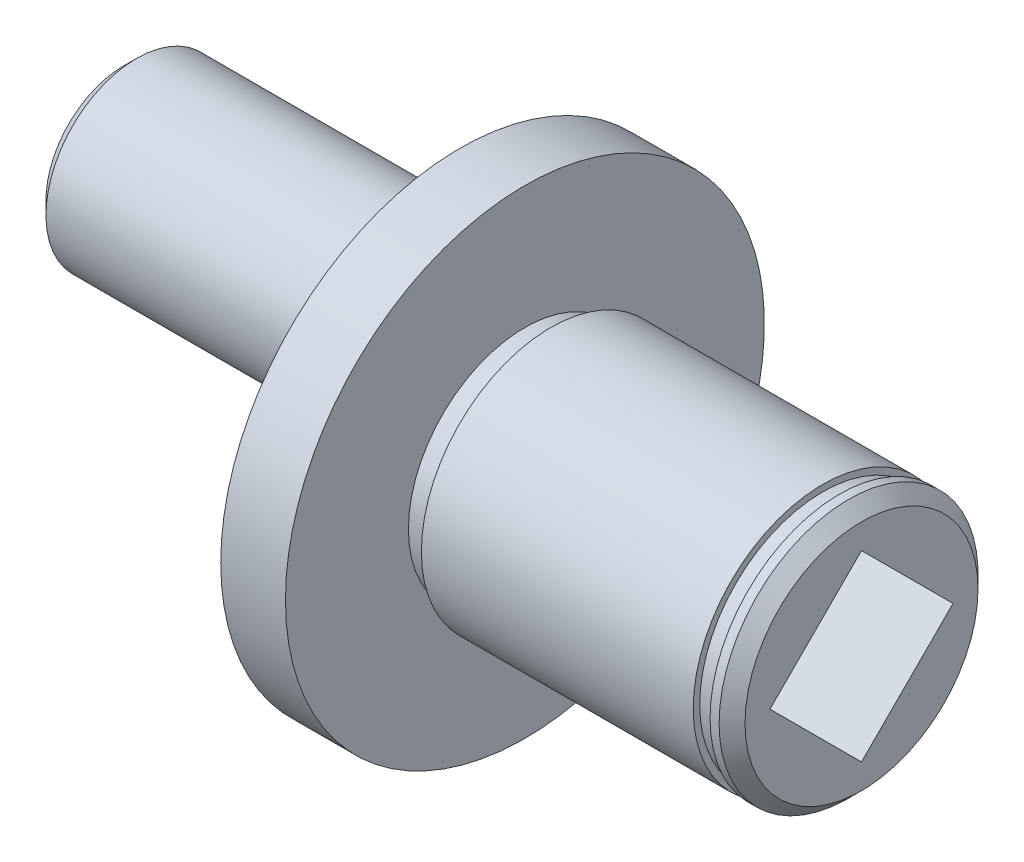
ISO-10303-21;
HEADER;
FILE_DESCRIPTION(('STEP AP214'),'2;1');
FILE_NAME('part.step','',(''),(''),'','','');
FILE_SCHEMA(('AUTOMOTIVE_DESIGN { 1 0 10303 214 1 1 1 1 }'));
ENDSEC;
DATA;
#1=APPLICATION_CONTEXT('core data for automotive mechanical design processes');
#2=APPLICATION_PROTOCOL_DEFINITION('international standard','automotive_design',2000,#1);
#3=PRODUCT_CONTEXT('',#1,'mechanical');
#4=PRODUCT('Part','Part','',(#3));
#5=PRODUCT_RELATED_PRODUCT_CATEGORY('part','',(#4));
#6=PRODUCT_DEFINITION_FORMATION('','',#4);
#7=PRODUCT_DEFINITION_CONTEXT('part definition',#1,'design');
#8=PRODUCT_DEFINITION('design','',#6,#7);
#9=PRODUCT_DEFINITION_SHAPE('','',#8);
#10=(LENGTH_UNIT() NAMED_UNIT(*) SI_UNIT(.MILLI.,.METRE.));
#11=(NAMED_UNIT(*) PLANE_ANGLE_UNIT() SI_UNIT($,.RADIAN.));
#12=(NAMED_UNIT(*) SI_UNIT($,.STERADIAN.) SOLID_ANGLE_UNIT());
#13=UNCERTAINTY_MEASURE_WITH_UNIT(LENGTH_MEASURE(1.E-05),#10,'distance_accuracy_value','');
#14=(GEOMETRIC_REPRESENTATION_CONTEXT(3) GLOBAL_UNCERTAINTY_ASSIGNED_CONTEXT((#13)) GLOBAL_UNIT_ASSIGNED_CONTEXT((#10,
#11,#12)) REPRESENTATION_CONTEXT('',''));
#15=CARTESIAN_POINT('',(0.,0.,0.));
#16=DIRECTION('',(0.,0.,1.));
#17=DIRECTION('',(1.,0.,0.));
#18=AXIS2_PLACEMENT_3D('',#15,#16,#17);
#19=CARTESIAN_POINT('',(30.9999999999999,9.00000000000012,0.));
#20=DIRECTION('',(-1.,0.,0.));
#21=DIRECTION('',(0.,0.,1.));
#22=AXIS2_PLACEMENT_3D('',#19,#20,#21);
#23=PLANE('',#22);
#24=CARTESIAN_POINT('',(30.9999999999999,0.,0.));
#25=DIRECTION('',(-1.,0.,0.));
#26=DIRECTION('',(0.,0.,1.));
#27=AXIS2_PLACEMENT_3D('',#24,#25,#26);
#28=CIRCLE('',#27,9.00000000000012);
#29=CARTESIAN_POINT('',(30.9999999999999,0.,9.00000000000012));
#30=VERTEX_POINT('',#29);
#31=EDGE_CURVE('E179',#30,#30,#28,.T.);
#32=ORIENTED_EDGE('',*,*,#31,.F.);
#33=EDGE_LOOP('',(#32));
#34=FACE_BOUND('',#33,.T.);
#35=DIRECTION('',(0.,0.707106781186548,-0.707106781186547));
#36=VECTOR('',#35,1.);
#37=CARTESIAN_POINT('',(31.0000000000059,-7.07106781186548,0.));
#38=LINE('',#37,#36);
#39=CARTESIAN_POINT('',(30.9999999999999,-7.07106781186548,0.));
#40=VERTEX_POINT('',#39);
#41=CARTESIAN_POINT('',(31.0000000000059,0.,-7.07106781186548));
#42=VERTEX_POINT('',#41);
#43=EDGE_CURVE('E135',#40,#42,#38,.T.);
#44=ORIENTED_EDGE('',*,*,#43,.F.);
#45=DIRECTION('',(0.,-0.707106781186547,-0.707106781186547));
#46=VECTOR('',#45,1.);
#47=CARTESIAN_POINT('',(31.0000000000059,0.,7.07106781186548));
#48=LINE('',#47,#46);
#49=CARTESIAN_POINT('',(31.0000000000059,0.,7.07106781186548));
#50=VERTEX_POINT('',#49);
#51=EDGE_CURVE('E111',#50,#40,#48,.T.);
#52=ORIENTED_EDGE('',*,*,#51,.F.);
#53=DIRECTION('',(0.,-0.707106781186548,0.707106781186548));
#54=VECTOR('',#53,1.);
#55=CARTESIAN_POINT('',(31.0000000000059,0.,7.07106781186548));
#56=LINE('',#55,#54);
#57=CARTESIAN_POINT('',(31.0000000000059,7.07106781186547,0.));
#58=VERTEX_POINT('',#57);
#59=EDGE_CURVE('E107',#58,#50,#56,.T.);
#60=ORIENTED_EDGE('',*,*,#59,.F.);
#61=DIRECTION('',(0.,0.707106781186547,0.707106781186548));
#62=VECTOR('',#61,1.);
#63=CARTESIAN_POINT('',(31.0000000000059,7.07106781186547,0.));
#64=LINE('',#63,#62);
#65=EDGE_CURVE('E138',#42,#58,#64,.T.);
#66=ORIENTED_EDGE('',*,*,#65,.F.);
#67=EDGE_LOOP('',(#44,#52,#60,#66));
#68=FACE_BOUND('',#67,.T.);
#69=ADVANCED_FACE('F39',(#34,#68),#23,.F.);
#70=CARTESIAN_POINT('',(0.,0.,0.));
#71=DIRECTION('',(1.,0.,0.));
#72=DIRECTION('',(0.,0.,-1.));
#73=AXIS2_PLACEMENT_3D('',#70,#71,#72);
#74=PLANE('',#73);
#75=CARTESIAN_POINT('',(0.,5.,0.));
#76=DIRECTION('',(1.,0.,0.));
#77=DIRECTION('',(0.,1.,0.));
#78=AXIS2_PLACEMENT_3D('',#75,#76,#77);
#79=CIRCLE('',#78,6.);
#80=CARTESIAN_POINT('',(0.,11.,0.));
#81=VERTEX_POINT('',#80);
#82=EDGE_CURVE('E175',#81,#81,#79,.T.);
#83=ORIENTED_EDGE('',*,*,#82,.T.);
#84=EDGE_LOOP('',(#83));
#85=FACE_BOUND('',#84,.T.);
#86=CARTESIAN_POINT('',(0.,0.,0.));
#87=DIRECTION('',(-1.,0.,0.));
#88=DIRECTION('',(0.,0.,1.));
#89=AXIS2_PLACEMENT_3D('',#86,#87,#88);
#90=CIRCLE('',#89,18.5);
#91=CARTESIAN_POINT('',(0.,0.,18.5));
#92=VERTEX_POINT('',#91);
#93=EDGE_CURVE('E218',#92,#92,#90,.T.);
#94=ORIENTED_EDGE('',*,*,#93,.T.);
#95=EDGE_LOOP('',(#94));
#96=FACE_BOUND('',#95,.T.);
#97=ADVANCED_FACE('F41',(#85,#96),#74,.F.);
#98=CARTESIAN_POINT('',(0.,0.,0.));
#99=DIRECTION('',(-1.,0.,0.));
#100=DIRECTION('',(0.,0.,1.));
#101=AXIS2_PLACEMENT_3D('',#98,#99,#100);
#102=CYLINDRICAL_SURFACE('',#101,18.5);
#103=ORIENTED_EDGE('',*,*,#93,.F.);
#104=EDGE_LOOP('',(#103));
#105=FACE_BOUND('',#104,.T.);
#106=CARTESIAN_POINT('',(4.99999999999988,0.,0.));
#107=DIRECTION('',(-1.,0.,0.));
#108=DIRECTION('',(0.,0.,1.));
#109=AXIS2_PLACEMENT_3D('',#106,#107,#108);
#110=CIRCLE('',#109,18.5);
#111=CARTESIAN_POINT('',(4.99999999999988,0.,18.5));
#112=VERTEX_POINT('',#111);
#113=EDGE_CURVE('E215',#112,#112,#110,.T.);
#114=ORIENTED_EDGE('',*,*,#113,.T.);
#115=EDGE_LOOP('',(#114));
#116=FACE_BOUND('',#115,.T.);
#117=ADVANCED_FACE('F262',(#105,#116),#102,.T.);
#118=CARTESIAN_POINT('',(4.99999999999988,18.5,0.));
#119=DIRECTION('',(-1.,0.,0.));
#120=DIRECTION('',(0.,0.,1.));
#121=AXIS2_PLACEMENT_3D('',#118,#119,#120);
#122=PLANE('',#121);
#123=ORIENTED_EDGE('',*,*,#113,.F.);
#124=EDGE_LOOP('',(#123));
#125=FACE_BOUND('',#124,.T.);
#126=CARTESIAN_POINT('',(4.99999999999988,0.,0.));
#127=DIRECTION('',(-1.,0.,0.));
#128=DIRECTION('',(0.,0.,1.));
#129=AXIS2_PLACEMENT_3D('',#126,#127,#128);
#130=CIRCLE('',#129,9.);
#131=CARTESIAN_POINT('',(4.99999999999988,0.,9.));
#132=VERTEX_POINT('',#131);
#133=EDGE_CURVE('E211',#132,#132,#130,.T.);
#134=ORIENTED_EDGE('',*,*,#133,.T.);
#135=EDGE_LOOP('',(#134));
#136=FACE_BOUND('',#135,.T.);
#137=ADVANCED_FACE('F301',(#125,#136),#122,.F.);
#138=CARTESIAN_POINT('',(0.,0.,0.));
#139=DIRECTION('',(-1.,0.,0.));
#140=DIRECTION('',(0.,0.,1.));
#141=AXIS2_PLACEMENT_3D('',#138,#139,#140);
#142=CYLINDRICAL_SURFACE('',#141,9.);
#143=ORIENTED_EDGE('',*,*,#133,.F.);
#144=EDGE_LOOP('',(#143));
#145=FACE_BOUND('',#144,.T.);
#146=CARTESIAN_POINT('',(7.,0.,0.));
#147=DIRECTION('',(-1.,0.,0.));
#148=DIRECTION('',(0.,0.,1.));
#149=AXIS2_PLACEMENT_3D('',#146,#147,#148);
#150=CIRCLE('',#149,9.);
#151=CARTESIAN_POINT('',(7.,0.,9.));
#152=VERTEX_POINT('',#151);
#153=EDGE_CURVE('E207',#152,#152,#150,.T.);
#154=ORIENTED_EDGE('',*,*,#153,.T.);
#155=EDGE_LOOP('',(#154));
#156=FACE_BOUND('',#155,.T.);
#157=ADVANCED_FACE('F297',(#145,#156),#142,.T.);
#158=CARTESIAN_POINT('',(7.,9.,0.));
#159=DIRECTION('',(1.,0.,0.));
#160=DIRECTION('',(0.,0.,-1.));
#161=AXIS2_PLACEMENT_3D('',#158,#159,#160);
#162=PLANE('',#161);
#163=ORIENTED_EDGE('',*,*,#153,.F.);
#164=EDGE_LOOP('',(#163));
#165=FACE_BOUND('',#164,.T.);
#166=CARTESIAN_POINT('',(7.,0.,0.));
#167=DIRECTION('',(-1.,0.,0.));
#168=DIRECTION('',(0.,0.,1.));
#169=AXIS2_PLACEMENT_3D('',#166,#167,#168);
#170=CIRCLE('',#169,10.);
#171=CARTESIAN_POINT('',(7.,0.,10.));
#172=VERTEX_POINT('',#171);
#173=EDGE_CURVE('E203',#172,#172,#170,.T.);
#174=ORIENTED_EDGE('',*,*,#173,.T.);
#175=EDGE_LOOP('',(#174));
#176=FACE_BOUND('',#175,.T.);
#177=ADVANCED_FACE('F293',(#165,#176),#162,.F.);
#178=CARTESIAN_POINT('',(0.,0.,0.));
#179=DIRECTION('',(-1.,0.,0.));
#180=DIRECTION('',(0.,0.,1.));
#181=AXIS2_PLACEMENT_3D('',#178,#179,#180);
#182=CYLINDRICAL_SURFACE('',#181,10.);
#183=ORIENTED_EDGE('',*,*,#173,.F.);
#184=EDGE_LOOP('',(#183));
#185=FACE_BOUND('',#184,.T.);
#186=CARTESIAN_POINT('',(28.,0.,0.));
#187=DIRECTION('',(-1.,0.,0.));
#188=DIRECTION('',(0.,0.,1.));
#189=AXIS2_PLACEMENT_3D('',#186,#187,#188);
#190=CIRCLE('',#189,10.);
#191=CARTESIAN_POINT('',(28.,0.,10.));
#192=VERTEX_POINT('',#191);
#193=EDGE_CURVE('E199',#192,#192,#190,.T.);
#194=ORIENTED_EDGE('',*,*,#193,.T.);
#195=EDGE_LOOP('',(#194));
#196=FACE_BOUND('',#195,.T.);
#197=ADVANCED_FACE('F289',(#185,#196),#182,.T.);
#198=CARTESIAN_POINT('',(28.,9.50000000000012,0.));
#199=DIRECTION('',(-1.,0.,0.));
#200=DIRECTION('',(0.,0.,1.));
#201=AXIS2_PLACEMENT_3D('',#198,#199,#200);
#202=PLANE('',#201);
#203=ORIENTED_EDGE('',*,*,#193,.F.);
#204=EDGE_LOOP('',(#203));
#205=FACE_BOUND('',#204,.T.);
#206=CARTESIAN_POINT('',(28.,0.,0.));
#207=DIRECTION('',(-1.,0.,0.));
#208=DIRECTION('',(0.,0.,1.));
#209=AXIS2_PLACEMENT_3D('',#206,#207,#208);
#210=CIRCLE('',#209,9.50000000000012);
#211=CARTESIAN_POINT('',(28.,0.,9.50000000000012));
#212=VERTEX_POINT('',#211);
#213=EDGE_CURVE('E195',#212,#212,#210,.T.);
#214=ORIENTED_EDGE('',*,*,#213,.T.);
#215=EDGE_LOOP('',(#214));
#216=FACE_BOUND('',#215,.T.);
#217=ADVANCED_FACE('F285',(#205,#216),#202,.F.);
#218=CARTESIAN_POINT('',(0.,0.,0.));
#219=DIRECTION('',(-1.,0.,0.));
#220=DIRECTION('',(0.,0.,1.));
#221=AXIS2_PLACEMENT_3D('',#218,#219,#220);
#222=CYLINDRICAL_SURFACE('',#221,9.50000000000012);
#223=ORIENTED_EDGE('',*,*,#213,.F.);
#224=EDGE_LOOP('',(#223));
#225=FACE_BOUND('',#224,.T.);
#226=CARTESIAN_POINT('',(29.2999999999999,0.,0.));
#227=DIRECTION('',(-1.,0.,0.));
#228=DIRECTION('',(0.,0.,1.));
#229=AXIS2_PLACEMENT_3D('',#226,#227,#228);
#230=CIRCLE('',#229,9.50000000000012);
#231=CARTESIAN_POINT('',(29.2999999999999,0.,9.50000000000012));
#232=VERTEX_POINT('',#231);
#233=EDGE_CURVE('E191',#232,#232,#230,.T.);
#234=ORIENTED_EDGE('',*,*,#233,.T.);
#235=EDGE_LOOP('',(#234));
#236=FACE_BOUND('',#235,.T.);
#237=ADVANCED_FACE('F281',(#225,#236),#222,.T.);
#238=CARTESIAN_POINT('',(29.2999999999999,10.,0.));
#239=DIRECTION('',(1.,0.,0.));
#240=DIRECTION('',(0.,0.,-1.));
#241=AXIS2_PLACEMENT_3D('',#238,#239,#240);
#242=PLANE('',#241);
#243=ORIENTED_EDGE('',*,*,#233,.F.);
#244=EDGE_LOOP('',(#243));
#245=FACE_BOUND('',#244,.T.);
#246=CARTESIAN_POINT('',(29.2999999999999,0.,0.));
#247=DIRECTION('',(-1.,0.,0.));
#248=DIRECTION('',(0.,0.,1.));
#249=AXIS2_PLACEMENT_3D('',#246,#247,#248);
#250=CIRCLE('',#249,10.);
#251=CARTESIAN_POINT('',(29.2999999999999,0.,10.));
#252=VERTEX_POINT('',#251);
#253=EDGE_CURVE('E187',#252,#252,#250,.T.);
#254=ORIENTED_EDGE('',*,*,#253,.T.);
#255=EDGE_LOOP('',(#254));
#256=FACE_BOUND('',#255,.T.);
#257=ADVANCED_FACE('F277',(#245,#256),#242,.F.);
#258=CARTESIAN_POINT('',(0.,0.,0.));
#259=DIRECTION('',(-1.,0.,0.));
#260=DIRECTION('',(0.,0.,1.));
#261=AXIS2_PLACEMENT_3D('',#258,#259,#260);
#262=CYLINDRICAL_SURFACE('',#261,10.);
#263=ORIENTED_EDGE('',*,*,#253,.F.);
#264=EDGE_LOOP('',(#263));
#265=FACE_BOUND('',#264,.T.);
#266=CARTESIAN_POINT('',(30.,0.,0.));
#267=DIRECTION('',(-1.,0.,0.));
#268=DIRECTION('',(0.,0.,1.));
#269=AXIS2_PLACEMENT_3D('',#266,#267,#268);
#270=CIRCLE('',#269,10.);
#271=CARTESIAN_POINT('',(30.,0.,10.));
#272=VERTEX_POINT('',#271);
#273=EDGE_CURVE('E183',#272,#272,#270,.T.);
#274=ORIENTED_EDGE('',*,*,#273,.T.);
#275=EDGE_LOOP('',(#274));
#276=FACE_BOUND('',#275,.T.);
#277=ADVANCED_FACE('F273',(#265,#276),#262,.T.);
#278=CARTESIAN_POINT('',(30.9999999999999,0.,0.));
#279=DIRECTION('',(-1.,0.,0.));
#280=DIRECTION('',(0.,0.,1.));
#281=AXIS2_PLACEMENT_3D('',#278,#279,#280);
#282=CONICAL_SURFACE('',#281,9.00000000000012,0.785398163397448);
#283=ORIENTED_EDGE('',*,*,#273,.F.);
#284=EDGE_LOOP('',(#283));
#285=FACE_BOUND('',#284,.T.);
#286=ORIENTED_EDGE('',*,*,#31,.T.);
#287=EDGE_LOOP('',(#286));
#288=FACE_BOUND('',#287,.T.);
#289=ADVANCED_FACE('F270',(#285,#288),#282,.T.);
#290=CARTESIAN_POINT('',(0.,5.,0.));
#291=DIRECTION('',(1.,0.,0.));
#292=DIRECTION('',(0.,1.,0.));
#293=AXIS2_PLACEMENT_3D('',#290,#291,#292);
#294=CYLINDRICAL_SURFACE('',#293,6.);
#295=CARTESIAN_POINT('',(-2.,5.,0.));
#296=DIRECTION('',(1.,0.,0.));
#297=DIRECTION('',(0.,1.,0.));
#298=AXIS2_PLACEMENT_3D('',#295,#296,#297);
#299=CIRCLE('',#298,6.);
#300=CARTESIAN_POINT('',(-2.,11.,0.));
#301=VERTEX_POINT('',#300);
#302=EDGE_CURVE('E171',#301,#301,#299,.T.);
#303=ORIENTED_EDGE('',*,*,#302,.T.);
#304=EDGE_LOOP('',(#303));
#305=FACE_BOUND('',#304,.T.);
#306=ORIENTED_EDGE('',*,*,#82,.F.);
#307=EDGE_LOOP('',(#306));
#308=FACE_BOUND('',#307,.T.);
#309=ADVANCED_FACE('F268',(#305,#308),#294,.T.);
#310=CARTESIAN_POINT('',(-2.,12.,0.));
#311=DIRECTION('',(1.,0.,0.));
#312=DIRECTION('',(0.,1.,0.));
#313=AXIS2_PLACEMENT_3D('',#310,#311,#312);
#314=PLANE('',#313);
#315=CARTESIAN_POINT('',(-2.,5.,0.));
#316=DIRECTION('',(1.,0.,0.));
#317=DIRECTION('',(0.,1.,0.));
#318=AXIS2_PLACEMENT_3D('',#315,#316,#317);
#319=CIRCLE('',#318,6.99999999999999);
#320=CARTESIAN_POINT('',(-2.,12.,0.));
#321=VERTEX_POINT('',#320);
#322=EDGE_CURVE('E167',#321,#321,#319,.T.);
#323=ORIENTED_EDGE('',*,*,#322,.T.);
#324=EDGE_LOOP('',(#323));
#325=FACE_BOUND('',#324,.T.);
#326=ORIENTED_EDGE('',*,*,#302,.F.);
#327=EDGE_LOOP('',(#326));
#328=FACE_BOUND('',#327,.T.);
#329=ADVANCED_FACE('F372',(#325,#328),#314,.T.);
#330=CARTESIAN_POINT('',(0.,5.,0.));
#331=DIRECTION('',(1.,0.,0.));
#332=DIRECTION('',(0.,1.,0.));
#333=AXIS2_PLACEMENT_3D('',#330,#331,#332);
#334=CYLINDRICAL_SURFACE('',#333,7.);
#335=CARTESIAN_POINT('',(-25.,5.,0.));
#336=DIRECTION('',(1.,0.,0.));
#337=DIRECTION('',(0.,1.,0.));
#338=AXIS2_PLACEMENT_3D('',#335,#336,#337);
#339=CIRCLE('',#338,7.);
#340=CARTESIAN_POINT('',(-25.,12.,0.));
#341=VERTEX_POINT('',#340);
#342=EDGE_CURVE('E163',#341,#341,#339,.T.);
#343=ORIENTED_EDGE('',*,*,#342,.T.);
#344=EDGE_LOOP('',(#343));
#345=FACE_BOUND('',#344,.T.);
#346=ORIENTED_EDGE('',*,*,#322,.F.);
#347=EDGE_LOOP('',(#346));
#348=FACE_BOUND('',#347,.T.);
#349=ADVANCED_FACE('F379',(#345,#348),#334,.T.);
#350=CARTESIAN_POINT('',(-25.,5.,0.));
#351=DIRECTION('',(1.,0.,0.));
#352=DIRECTION('',(0.,1.,0.));
#353=AXIS2_PLACEMENT_3D('',#350,#351,#352);
#354=CONICAL_SURFACE('',#353,7.,0.785398163397448);
#355=CARTESIAN_POINT('',(-26.,5.,0.));
#356=DIRECTION('',(1.,0.,0.));
#357=DIRECTION('',(0.,1.,0.));
#358=AXIS2_PLACEMENT_3D('',#355,#356,#357);
#359=CIRCLE('',#358,6.);
#360=CARTESIAN_POINT('',(-26.,11.,0.));
#361=VERTEX_POINT('',#360);
#362=EDGE_CURVE('E159',#361,#361,#359,.T.);
#363=ORIENTED_EDGE('',*,*,#362,.T.);
#364=EDGE_LOOP('',(#363));
#365=FACE_BOUND('',#364,.T.);
#366=ORIENTED_EDGE('',*,*,#342,.F.);
#367=EDGE_LOOP('',(#366));
#368=FACE_BOUND('',#367,.T.);
#369=ADVANCED_FACE('F386',(#365,#368),#354,.T.);
#370=CARTESIAN_POINT('',(-26.,5.,0.));
#371=DIRECTION('',(-1.,0.,0.));
#372=DIRECTION('',(0.,-1.,0.));
#373=AXIS2_PLACEMENT_3D('',#370,#371,#372);
#374=PLANE('',#373);
#375=ORIENTED_EDGE('',*,*,#362,.F.);
#376=EDGE_LOOP('',(#375));
#377=FACE_BOUND('',#376,.T.);
#378=ADVANCED_FACE('F394',(#377),#374,.T.);
#379=CARTESIAN_POINT('',(19.0000000000059,0.,7.07106781186548));
#380=DIRECTION('',(0.,-0.707106781186548,0.707106781186548));
#381=DIRECTION('',(0.,-0.707106781186548,-0.707106781186548));
#382=AXIS2_PLACEMENT_3D('',#379,#380,#381);
#383=PLANE('',#382);
#384=ORIENTED_EDGE('',*,*,#51,.T.);
#385=DIRECTION('',(1.,0.,0.));
#386=VECTOR('',#385,1.);
#387=CARTESIAN_POINT('',(19.0000000000059,-7.07106781186548,0.));
#388=LINE('',#387,#386);
#389=CARTESIAN_POINT('',(19.0000000000059,-7.07106781186548,0.));
#390=VERTEX_POINT('',#389);
#391=EDGE_CURVE('E56',#390,#40,#388,.T.);
#392=ORIENTED_EDGE('',*,*,#391,.F.);
#393=DIRECTION('',(0.,-0.707106781186547,-0.707106781186547));
#394=VECTOR('',#393,1.);
#395=CARTESIAN_POINT('',(19.0000000000059,0.,7.07106781186548));
#396=LINE('',#395,#394);
#397=CARTESIAN_POINT('',(19.0000000000059,-3.53553390593274,3.53553390593274));
#398=VERTEX_POINT('',#397);
#399=EDGE_CURVE('E98',#398,#390,#396,.T.);
#400=ORIENTED_EDGE('',*,*,#399,.F.);
#401=CARTESIAN_POINT('',(19.0000000000059,0.,7.07106781186548));
#402=VERTEX_POINT('',#401);
#403=EDGE_CURVE('E106',#402,#398,#396,.T.);
#404=ORIENTED_EDGE('',*,*,#403,.F.);
#405=DIRECTION('',(1.,0.,0.));
#406=VECTOR('',#405,1.);
#407=CARTESIAN_POINT('',(19.0000000000059,0.,7.07106781186548));
#408=LINE('',#407,#406);
#409=EDGE_CURVE('E145',#402,#50,#408,.T.);
#410=ORIENTED_EDGE('',*,*,#409,.T.);
#411=EDGE_LOOP('',(#384,#392,#400,#404,#410));
#412=FACE_BOUND('',#411,.T.);
#413=ADVANCED_FACE('F109',(#412),#383,.F.);
#414=CARTESIAN_POINT('',(19.0000000000059,0.,7.07106781186548));
#415=DIRECTION('',(0.,0.707106781186547,0.707106781186547));
#416=DIRECTION('',(0.,-0.707106781186548,0.707106781186548));
#417=AXIS2_PLACEMENT_3D('',#414,#415,#416);
#418=PLANE('',#417);
#419=ORIENTED_EDGE('',*,*,#59,.T.);
#420=ORIENTED_EDGE('',*,*,#409,.F.);
#421=DIRECTION('',(0.,-0.707106781186548,0.707106781186548));
#422=VECTOR('',#421,1.);
#423=CARTESIAN_POINT('',(19.0000000000059,0.,7.07106781186548));
#424=LINE('',#423,#422);
#425=CARTESIAN_POINT('',(19.0000000000059,3.53553390593274,3.53553390593274));
#426=VERTEX_POINT('',#425);
#427=EDGE_CURVE('E129',#426,#402,#424,.T.);
#428=ORIENTED_EDGE('',*,*,#427,.F.);
#429=CARTESIAN_POINT('',(19.0000000000059,7.07106781186547,0.));
#430=VERTEX_POINT('',#429);
#431=EDGE_CURVE('E115',#430,#426,#424,.T.);
#432=ORIENTED_EDGE('',*,*,#431,.F.);
#433=DIRECTION('',(1.,0.,0.));
#434=VECTOR('',#433,1.);
#435=CARTESIAN_POINT('',(19.0000000000059,7.07106781186547,0.));
#436=LINE('',#435,#434);
#437=EDGE_CURVE('E149',#430,#58,#436,.T.);
#438=ORIENTED_EDGE('',*,*,#437,.T.);
#439=EDGE_LOOP('',(#419,#420,#428,#432,#438));
#440=FACE_BOUND('',#439,.T.);
#441=ADVANCED_FACE('F239',(#440),#418,.F.);
#442=CARTESIAN_POINT('',(19.0000000000059,7.07106781186547,0.));
#443=DIRECTION('',(0.,0.707106781186548,-0.707106781186547));
#444=DIRECTION('',(0.,0.707106781186547,0.707106781186548));
#445=AXIS2_PLACEMENT_3D('',#442,#443,#444);
#446=PLANE('',#445);
#447=ORIENTED_EDGE('',*,*,#65,.T.);
#448=ORIENTED_EDGE('',*,*,#437,.F.);
#449=DIRECTION('',(0.,0.707106781186547,0.707106781186548));
#450=VECTOR('',#449,1.);
#451=CARTESIAN_POINT('',(19.0000000000059,7.07106781186547,0.));
#452=LINE('',#451,#450);
#453=CARTESIAN_POINT('',(19.0000000000059,3.53553390593274,-3.53553390593274));
#454=VERTEX_POINT('',#453);
#455=EDGE_CURVE('E122',#454,#430,#452,.T.);
#456=ORIENTED_EDGE('',*,*,#455,.F.);
#457=CARTESIAN_POINT('',(19.0000000000059,0.,-7.07106781186548));
#458=VERTEX_POINT('',#457);
#459=EDGE_CURVE('E64',#458,#454,#452,.T.);
#460=ORIENTED_EDGE('',*,*,#459,.F.);
#461=DIRECTION('',(1.,0.,0.));
#462=VECTOR('',#461,1.);
#463=CARTESIAN_POINT('',(19.0000000000059,0.,-7.07106781186548));
#464=LINE('',#463,#462);
#465=EDGE_CURVE('E114',#458,#42,#464,.T.);
#466=ORIENTED_EDGE('',*,*,#465,.T.);
#467=EDGE_LOOP('',(#447,#448,#456,#460,#466));
#468=FACE_BOUND('',#467,.T.);
#469=ADVANCED_FACE('F415',(#468),#446,.F.);
#470=CARTESIAN_POINT('',(19.0000000000059,-7.07106781186548,0.));
#471=DIRECTION('',(0.,-0.707106781186547,-0.707106781186548));
#472=DIRECTION('',(0.,0.707106781186548,-0.707106781186547));
#473=AXIS2_PLACEMENT_3D('',#470,#471,#472);
#474=PLANE('',#473);
#475=ORIENTED_EDGE('',*,*,#43,.T.);
#476=ORIENTED_EDGE('',*,*,#465,.F.);
#477=DIRECTION('',(0.,0.707106781186548,-0.707106781186547));
#478=VECTOR('',#477,1.);
#479=CARTESIAN_POINT('',(19.0000000000059,-7.07106781186548,0.));
#480=LINE('',#479,#478);
#481=CARTESIAN_POINT('',(19.0000000000059,-3.53553390593274,-3.53553390593274));
#482=VERTEX_POINT('',#481);
#483=EDGE_CURVE('E120',#482,#458,#480,.T.);
#484=ORIENTED_EDGE('',*,*,#483,.F.);
#485=EDGE_CURVE('E100',#390,#482,#480,.T.);
#486=ORIENTED_EDGE('',*,*,#485,.F.);
#487=ORIENTED_EDGE('',*,*,#391,.T.);
#488=EDGE_LOOP('',(#475,#476,#484,#486,#487));
#489=FACE_BOUND('',#488,.T.);
#490=ADVANCED_FACE('F118',(#489),#474,.F.);
#491=CARTESIAN_POINT('',(19.0000000000059,0.,7.07106781186548));
#492=DIRECTION('',(1.,0.,0.));
#493=DIRECTION('',(0.,0.,-1.));
#494=AXIS2_PLACEMENT_3D('',#491,#492,#493);
#495=PLANE('',#494);
#496=CARTESIAN_POINT('',(19.0000000000059,0.,0.));
#497=DIRECTION('',(1.,0.,0.));
#498=DIRECTION('',(0.,0.,-1.));
#499=AXIS2_PLACEMENT_3D('',#496,#497,#498);
#500=CIRCLE('',#499,5.);
#501=EDGE_CURVE('E11',#482,#398,#500,.F.);
#502=ORIENTED_EDGE('',*,*,#501,.T.);
#503=ORIENTED_EDGE('',*,*,#399,.T.);
#504=ORIENTED_EDGE('',*,*,#485,.T.);
#505=EDGE_LOOP('',(#502,#503,#504));
#506=FACE_BOUND('',#505,.T.);
#507=ADVANCED_FACE('F99',(#506),#495,.T.);
#508=EDGE_CURVE('E49',#398,#426,#500,.F.);
#509=ORIENTED_EDGE('',*,*,#508,.T.);
#510=ORIENTED_EDGE('',*,*,#427,.T.);
#511=ORIENTED_EDGE('',*,*,#403,.T.);
#512=EDGE_LOOP('',(#509,#510,#511));
#513=FACE_BOUND('',#512,.T.);
#514=ADVANCED_FACE('F234',(#513),#495,.T.);
#515=EDGE_CURVE('E224',#426,#454,#500,.F.);
#516=ORIENTED_EDGE('',*,*,#515,.T.);
#517=ORIENTED_EDGE('',*,*,#455,.T.);
#518=ORIENTED_EDGE('',*,*,#431,.T.);
#519=EDGE_LOOP('',(#516,#517,#518));
#520=FACE_BOUND('',#519,.T.);
#521=ADVANCED_FACE('F241',(#520),#495,.T.);
#522=EDGE_CURVE('E43',#454,#482,#500,.F.);
#523=ORIENTED_EDGE('',*,*,#522,.T.);
#524=ORIENTED_EDGE('',*,*,#483,.T.);
#525=ORIENTED_EDGE('',*,*,#459,.T.);
#526=EDGE_LOOP('',(#523,#524,#525));
#527=FACE_BOUND('',#526,.T.);
#528=ADVANCED_FACE('F251',(#527),#495,.T.);
#529=CARTESIAN_POINT('',(13.9999999999999,0.,0.));
#530=DIRECTION('',(1.,0.,0.));
#531=DIRECTION('',(0.,0.,-1.));
#532=AXIS2_PLACEMENT_3D('',#529,#530,#531);
#533=CONICAL_SURFACE('',#532,5.,1.02974425867666);
#534=CARTESIAN_POINT('',(10.9956969048621,0.,0.));
#535=VERTEX_POINT('',#534);
#536=VERTEX_LOOP('',#535);
#537=FACE_BOUND('',#536,.T.);
#538=CARTESIAN_POINT('',(13.9999999999999,0.,0.));
#539=DIRECTION('',(1.,0.,0.));
#540=DIRECTION('',(0.,0.,-1.));
#541=AXIS2_PLACEMENT_3D('',#538,#539,#540);
#542=CIRCLE('',#541,5.);
#543=CARTESIAN_POINT('',(13.9999999999999,0.,-5.));
#544=VERTEX_POINT('',#543);
#545=EDGE_CURVE('E148',#544,#544,#542,.T.);
#546=ORIENTED_EDGE('',*,*,#545,.T.);
#547=EDGE_LOOP('',(#546));
#548=FACE_BOUND('',#547,.T.);
#549=ADVANCED_FACE('F245',(#537,#548),#533,.F.);
#550=CARTESIAN_POINT('',(30.9999999999999,0.,0.));
#551=DIRECTION('',(1.,0.,0.));
#552=DIRECTION('',(0.,0.,-1.));
#553=AXIS2_PLACEMENT_3D('',#550,#551,#552);
#554=CYLINDRICAL_SURFACE('',#553,5.);
#555=ORIENTED_EDGE('',*,*,#545,.F.);
#556=EDGE_LOOP('',(#555));
#557=FACE_BOUND('',#556,.T.);
#558=ORIENTED_EDGE('',*,*,#501,.F.);
#559=ORIENTED_EDGE('',*,*,#522,.F.);
#560=ORIENTED_EDGE('',*,*,#515,.F.);
#561=ORIENTED_EDGE('',*,*,#508,.F.);
#562=EDGE_LOOP('',(#558,#559,#560,#561));
#563=FACE_BOUND('',#562,.T.);
#564=ADVANCED_FACE('F243',(#557,#563),#554,.F.);
#565=CLOSED_SHELL('',(#69,#97,#117,#137,#157,#177,#197,#217,#237,#257,#277,#289,#309,#329,#349,
#369,#378,#413,#441,#469,#490,#507,#514,#521,#528,#549,#564));
#566=MANIFOLD_SOLID_BREP('B2',#565);
#567=ADVANCED_BREP_SHAPE_REPRESENTATION('',(#18,#566),#14);
#568=SHAPE_DEFINITION_REPRESENTATION(#9,#567);
ENDSEC;
END-ISO-10303-21;
